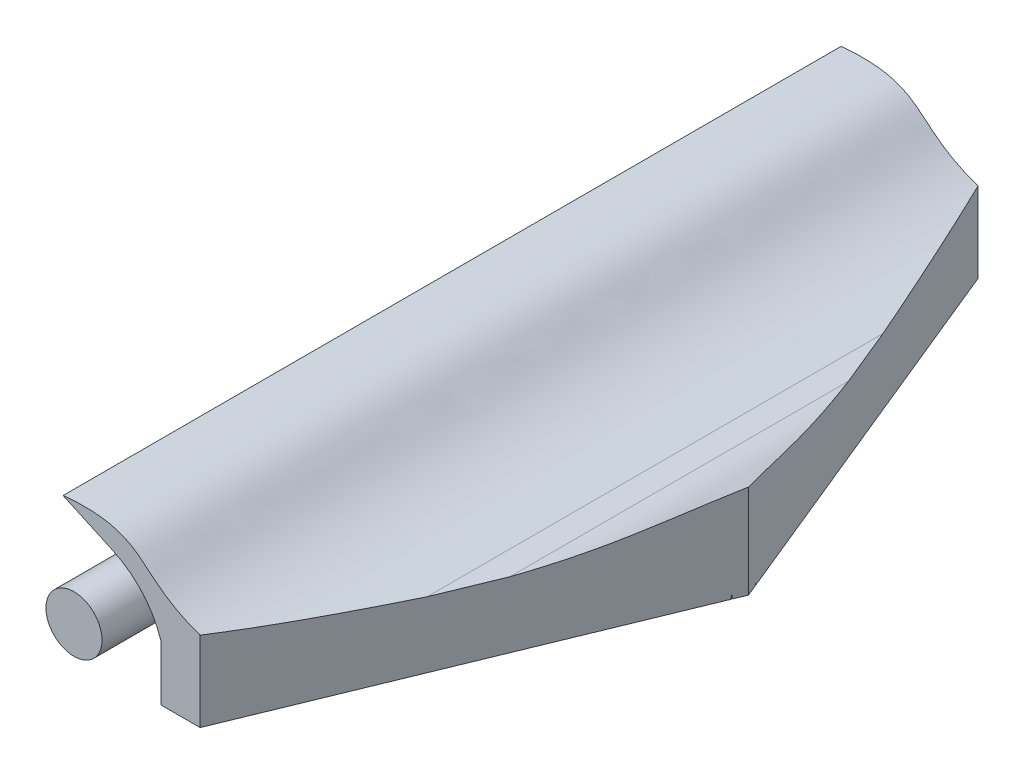
ISO-10303-21;
HEADER;
FILE_DESCRIPTION(('STEP AP214'),'2;1');
FILE_NAME('part.step','',(''),(''),'','','');
FILE_SCHEMA(('AUTOMOTIVE_DESIGN { 1 0 10303 214 1 1 1 1 }'));
ENDSEC;
DATA;
#1=APPLICATION_CONTEXT('core data for automotive mechanical design processes');
#2=APPLICATION_PROTOCOL_DEFINITION('international standard','automotive_design',2000,#1);
#3=PRODUCT_CONTEXT('',#1,'mechanical');
#4=PRODUCT('Part','Part','',(#3));
#5=PRODUCT_RELATED_PRODUCT_CATEGORY('part','',(#4));
#6=PRODUCT_DEFINITION_FORMATION('','',#4);
#7=PRODUCT_DEFINITION_CONTEXT('part definition',#1,'design');
#8=PRODUCT_DEFINITION('design','',#6,#7);
#9=PRODUCT_DEFINITION_SHAPE('','',#8);
#10=(LENGTH_UNIT() NAMED_UNIT(*) SI_UNIT(.MILLI.,.METRE.));
#11=(NAMED_UNIT(*) PLANE_ANGLE_UNIT() SI_UNIT($,.RADIAN.));
#12=(NAMED_UNIT(*) SI_UNIT($,.STERADIAN.) SOLID_ANGLE_UNIT());
#13=UNCERTAINTY_MEASURE_WITH_UNIT(LENGTH_MEASURE(1.E-05),#10,'distance_accuracy_value','');
#14=(GEOMETRIC_REPRESENTATION_CONTEXT(3) GLOBAL_UNCERTAINTY_ASSIGNED_CONTEXT((#13)) GLOBAL_UNIT_ASSIGNED_CONTEXT((#10,
#11,#12)) REPRESENTATION_CONTEXT('',''));
#15=CARTESIAN_POINT('',(0.,0.,0.));
#16=DIRECTION('',(0.,0.,1.));
#17=DIRECTION('',(1.,0.,0.));
#18=AXIS2_PLACEMENT_3D('',#15,#16,#17);
#19=CARTESIAN_POINT('',(21.6753952331775,-1.77266019011113,55.49));
#20=DIRECTION('',(0.,0.,-1.));
#21=DIRECTION('',(-1.,0.,0.));
#22=AXIS2_PLACEMENT_3D('',#19,#20,#21);
#23=CYLINDRICAL_SURFACE('',#22,1.75);
#24=CARTESIAN_POINT('',(21.6753952331775,-1.77266019011113,31.166761834755));
#25=DIRECTION('',(0.92525930002259,0.,-0.379335244502415));
#26=DIRECTION('',(-0.379335244502415,0.,-0.92525930002259));
#27=AXIS2_PLACEMENT_3D('',#24,#25,#26);
#28=ELLIPSE('',#27,4.61333352321514,1.75);
#29=CARTESIAN_POINT('',(19.9285760203476,-1.66719627358837,26.9059905366672));
#30=VERTEX_POINT('',#29);
#31=CARTESIAN_POINT('',(19.9402247485162,-2.,26.9344036467793));
#32=VERTEX_POINT('',#31);
#33=EDGE_CURVE('E179',#30,#32,#28,.F.);
#34=ORIENTED_EDGE('',*,*,#33,.T.);
#35=DIRECTION('',(0.,0.,-1.));
#36=VECTOR('',#35,1.);
#37=CARTESIAN_POINT('',(19.9402247485162,-2.,55.49));
#38=LINE('',#37,#36);
#39=CARTESIAN_POINT('',(19.9402247485162,-2.,28.5555963532207));
#40=VERTEX_POINT('',#39);
#41=EDGE_CURVE('E168',#32,#40,#38,.F.);
#42=ORIENTED_EDGE('',*,*,#41,.T.);
#43=CARTESIAN_POINT('',(21.6753952331775,-1.77266019011113,24.323238165245));
#44=DIRECTION('',(-0.92525930002259,0.,-0.379335244502416));
#45=DIRECTION('',(0.379335244502416,0.,-0.92525930002259));
#46=AXIS2_PLACEMENT_3D('',#43,#44,#45);
#47=ELLIPSE('',#46,4.61333352321513,1.75);
#48=CARTESIAN_POINT('',(19.9285760203476,-1.66719627358837,28.5840094633328));
#49=VERTEX_POINT('',#48);
#50=EDGE_CURVE('E177',#49,#40,#47,.F.);
#51=ORIENTED_EDGE('',*,*,#50,.F.);
#52=DIRECTION('',(0.,0.,-1.));
#53=VECTOR('',#52,1.);
#54=CARTESIAN_POINT('',(19.9285760203476,-1.66719627358837,55.49));
#55=LINE('',#54,#53);
#56=EDGE_CURVE('E305',#49,#30,#55,.T.);
#57=ORIENTED_EDGE('',*,*,#56,.T.);
#58=EDGE_LOOP('',(#34,#42,#51,#57));
#59=FACE_BOUND('',#58,.T.);
#60=ADVANCED_FACE('F43',(#59),#23,.T.);
#61=CARTESIAN_POINT('',(7.61739130704758,10.,-3.12295698498672));
#62=DIRECTION('',(0.92525930002259,0.,-0.379335244502415));
#63=DIRECTION('',(-0.379335244502415,0.,-0.92525930002259));
#64=AXIS2_PLACEMENT_3D('',#61,#62,#63);
#65=PLANE('',#64);
#66=DIRECTION('',(0.,-1.,0.));
#67=VECTOR('',#66,1.);
#68=CARTESIAN_POINT('',(20.2725507957489,10.,27.745));
#69=LINE('',#68,#67);
#70=CARTESIAN_POINT('',(20.2725507957489,4.67911544791502,27.745));
#71=VERTEX_POINT('',#70);
#72=CARTESIAN_POINT('',(20.2725507957489,-2.,27.745));
#73=VERTEX_POINT('',#72);
#74=EDGE_CURVE('E608',#71,#73,#69,.T.);
#75=ORIENTED_EDGE('',*,*,#74,.T.);
#76=DIRECTION('',(0.379335244502415,0.,0.92525930002259));
#77=VECTOR('',#76,1.);
#78=CARTESIAN_POINT('',(16.4791983507247,-2.,18.4924069997741));
#79=LINE('',#78,#77);
#80=EDGE_CURVE('E62',#32,#73,#79,.T.);
#81=ORIENTED_EDGE('',*,*,#80,.F.);
#82=ORIENTED_EDGE('',*,*,#33,.F.);
#83=DIRECTION('',(0.0596243597949732,0.987569783832803,0.145433344799156));
#84=VECTOR('',#83,1.);
#85=CARTESIAN_POINT('',(20.2037610543757,2.89074657902551,27.5772108243985));
#86=LINE('',#85,#84);
#87=CARTESIAN_POINT('',(19.9084830512739,-2.,26.8569805731324));
#88=VERTEX_POINT('',#87);
#89=EDGE_CURVE('E600',#88,#30,#86,.T.);
#90=ORIENTED_EDGE('',*,*,#89,.F.);
#91=DIRECTION('',(-0.379335244502415,0.,-0.92525930002259));
#92=VECTOR('',#91,1.);
#93=CARTESIAN_POINT('',(25.1279562662495,-2.,39.5881101039773));
#94=LINE('',#93,#92);
#95=CARTESIAN_POINT('',(8.89773255997154,-2.,0.));
#96=VERTEX_POINT('',#95);
#97=EDGE_CURVE('E593',#88,#96,#94,.T.);
#98=ORIENTED_EDGE('',*,*,#97,.T.);
#99=DIRECTION('',(0.,-1.,0.));
#100=VECTOR('',#99,1.);
#101=CARTESIAN_POINT('',(8.89773255997154,10.,0.));
#102=LINE('',#101,#100);
#103=CARTESIAN_POINT('',(8.89773255997154,3.71152769426705,0.));
#104=VERTEX_POINT('',#103);
#105=EDGE_CURVE('E181',#104,#96,#102,.T.);
#106=ORIENTED_EDGE('',*,*,#105,.F.);
#107=CARTESIAN_POINT('',(8.89773256020127,3.71152769426705,7.04898028266554E-11));
#108=CARTESIAN_POINT('',(9.05407822295495,3.6572797498824,0.381352064495441));
#109=CARTESIAN_POINT('',(9.21057016520124,3.60604397801412,0.763060927801186));
#110=CARTESIAN_POINT('',(9.523734200367,3.50888937245856,1.52691807053927));
#111=CARTESIAN_POINT('',(9.68040620695662,3.46296860982706,1.90906613939935));
#112=CARTESIAN_POINT('',(9.99390001735064,3.37570704249431,2.67372765651594));
#113=CARTESIAN_POINT('',(10.1507217842295,3.3343653086633,3.05624101470518));
#114=CARTESIAN_POINT('',(10.4644943694529,3.25569416000564,3.82158250822616));
#115=CARTESIAN_POINT('',(10.6214451739467,3.21836435996396,4.20441060977398));
#116=CARTESIAN_POINT('',(10.9354575285465,3.14723950538034,4.97033693912361));
#117=CARTESIAN_POINT('',(11.0925190757886,3.113444362584,5.35343515994046));
#118=CARTESIAN_POINT('',(11.4067159371557,3.04899847280158,6.11981153079238));
#119=CARTESIAN_POINT('',(11.5638512403528,3.01834735421682,6.50308965417267));
#120=CARTESIAN_POINT('',(11.8782119422224,2.95985055526556,7.26986565820032));
#121=CARTESIAN_POINT('',(12.0354373481268,2.93200514595534,7.65336355648745));
#122=CARTESIAN_POINT('',(12.3499718067072,2.878838670191,8.42056338090885));
#123=CARTESIAN_POINT('',(12.507280868094,2.85351796297069,8.80426532829032));
#124=CARTESIAN_POINT('',(12.8219769989744,2.80515913754457,9.5718594972955));
#125=CARTESIAN_POINT('',(12.979364077318,2.7821214211949,9.95575174050591));
#126=CARTESIAN_POINT('',(13.294211817106,2.73812795287087,10.7237157078723));
#127=CARTESIAN_POINT('',(13.4516724869775,2.71717261937415,11.107787452583));
#128=CARTESIAN_POINT('',(13.6091499864008,2.69716019884859,11.4919002472612));
#129=B_SPLINE_CURVE_WITH_KNOTS('',3,(#107,#108,#109,#110,#111,#112,#113,#114,#115,#116,#117,
#118,#119,#120,#121,#122,#123,#124,#125,#126,#127,#128),.UNSPECIFIED.,.F.,.F.,(4,2,2,2,2,2,2,2,
2,2,4),(0.,1.24710836203711,2.49376268988389,3.74016359415216,4.98644471525424,6.23269471139653,
7.47879724055755,8.72502003902671,9.97141990725707,11.2180387807805,12.4649076715347),.UNSPECIFIED.);
#130=CARTESIAN_POINT('',(13.6091499864008,2.69716019884859,11.4919002472612));
#131=VERTEX_POINT('',#130);
#132=EDGE_CURVE('E12',#104,#131,#129,.T.);
#133=ORIENTED_EDGE('',*,*,#132,.T.);
#134=DIRECTION('',(0.379335244502415,0.,0.92525930002259));
#135=VECTOR('',#134,1.);
#136=CARTESIAN_POINT('',(-1.79344106666902,2.69716019884859,-26.0774815142241));
#137=LINE('',#136,#135);
#138=CARTESIAN_POINT('',(15.3226767719573,2.69716019884859,15.6714659932641));
#139=VERTEX_POINT('',#138);
#140=EDGE_CURVE('E216',#131,#139,#137,.T.);
#141=ORIENTED_EDGE('',*,*,#140,.T.);
#142=CARTESIAN_POINT('',(15.3226767719573,2.69716019884859,15.6714659932641));
#143=CARTESIAN_POINT('',(15.4266575512944,2.71039382821165,15.9250917359274));
#144=CARTESIAN_POINT('',(15.5306059619518,2.72547184417969,16.1786385262064));
#145=CARTESIAN_POINT('',(15.7384162692592,2.75954935490961,16.6855210852709));
#146=CARTESIAN_POINT('',(15.8422781603684,2.77854908394899,16.9388568405413));
#147=CARTESIAN_POINT('',(16.0498821708658,2.82070139363354,17.4452362087086));
#148=CARTESIAN_POINT('',(16.1536242891461,2.84385401238622,17.6982798189032));
#149=CARTESIAN_POINT('',(16.3609554334376,2.89450460709154,18.203993622775));
#150=CARTESIAN_POINT('',(16.4645444603902,2.92200255620644,18.4566638187489));
#151=CARTESIAN_POINT('',(16.6713688460444,2.98142873308947,18.9611415572966));
#152=CARTESIAN_POINT('',(16.7746045060016,3.01334966587837,19.212949834681));
#153=CARTESIAN_POINT('',(16.9808574049633,3.08169399857571,19.7160336258307));
#154=CARTESIAN_POINT('',(17.0838746515818,3.11811723881772,19.9673091581676));
#155=CARTESIAN_POINT('',(17.2896660117709,3.19537459756364,20.4692671824712));
#156=CARTESIAN_POINT('',(17.3924401356223,3.23620852601908,20.7199496995146));
#157=CARTESIAN_POINT('',(17.5977295694949,3.32202549137947,21.2206834452975));
#158=CARTESIAN_POINT('',(17.7002448998479,3.36700819121534,21.4707347236295));
#159=CARTESIAN_POINT('',(17.9058407930843,3.46103693349516,21.9722159727892));
#160=CARTESIAN_POINT('',(18.0089194196234,3.51011228073266,22.2236412205639));
#161=CARTESIAN_POINT('',(18.2148616928643,3.61132844946318,22.725967345925));
#162=CARTESIAN_POINT('',(18.3177253334437,3.66346935705868,22.9768682085779));
#163=CARTESIAN_POINT('',(18.5232989519508,3.76992925504931,23.4782951261125));
#164=CARTESIAN_POINT('',(18.6260089151081,3.82424844240502,23.7288211449667));
#165=CARTESIAN_POINT('',(18.8313484925791,3.93402139677703,24.2296771990011));
#166=CARTESIAN_POINT('',(18.9339781007132,3.98947524356362,24.4800072191086));
#167=CARTESIAN_POINT('',(19.1394126971326,4.10049327261835,24.9810950395476));
#168=CARTESIAN_POINT('',(19.2422176834462,4.15605748060615,25.2318528350701));
#169=CARTESIAN_POINT('',(19.447904102363,4.26610241274871,25.7335548908354));
#170=CARTESIAN_POINT('',(19.5507855291638,4.32058321184996,25.9844991369255));
#171=CARTESIAN_POINT('',(19.7566951629929,4.42746268643741,26.4867456495438));
#172=CARTESIAN_POINT('',(19.8597233553807,4.47986155633774,26.7380478803619));
#173=CARTESIAN_POINT('',(20.0659767980235,4.58181362178772,27.2411329976365));
#174=CARTESIAN_POINT('',(20.1692020391559,4.6313669459225,27.4929158618419));
#175=CARTESIAN_POINT('',(20.2725507957489,4.67911544791499,27.745));
#176=B_SPLINE_CURVE_WITH_KNOTS('',3,(#142,#143,#144,#145,#146,#147,#148,#149,#150,#151,#152,
#153,#154,#155,#156,#157,#158,#159,#160,#161,#162,#163,#164,#165,#166,#167,#168,#169,#170,#171,
#172,#173,#174,#175),.UNSPECIFIED.,.F.,.F.,(4,2,2,2,2,2,2,2,2,2,2,2,2,2,2,2,4),(0.,
0.823296536728848,1.64664227025425,2.46999555930528,3.29334376333992,4.11534980674984,
4.93732670751606,5.75926820492103,6.58114298198758,7.40951345214785,8.23790719989442,
9.06637602084461,9.89490328736118,10.7248556486235,11.5547503954963,12.3845674623551,
13.2143470017063),.UNSPECIFIED.);
#177=EDGE_CURVE('E219',#139,#71,#176,.T.);
#178=ORIENTED_EDGE('',*,*,#177,.T.);
#179=EDGE_LOOP('',(#75,#81,#82,#90,#98,#106,#133,#141,#178));
#180=FACE_BOUND('',#179,.T.);
#181=ADVANCED_FACE('F232',(#180),#65,.T.);
#182=CARTESIAN_POINT('',(27.0934636579418,10.,11.1077031712643));
#183=DIRECTION('',(-0.92525930002259,0.,-0.379335244502416));
#184=DIRECTION('',(-0.379335244502416,0.,0.92525930002259));
#185=AXIS2_PLACEMENT_3D('',#182,#183,#184);
#186=PLANE('',#185);
#187=DIRECTION('',(0.379335244502416,0.,-0.92525930002259));
#188=VECTOR('',#187,1.);
#189=CARTESIAN_POINT('',(27.0934636579418,-2.,11.1077031712643));
#190=LINE('',#189,#188);
#191=EDGE_CURVE('E165',#40,#73,#190,.T.);
#192=ORIENTED_EDGE('',*,*,#191,.T.);
#193=ORIENTED_EDGE('',*,*,#74,.F.);
#194=CARTESIAN_POINT('',(15.3226767719573,2.69716019884859,39.8185340067359));
#195=CARTESIAN_POINT('',(15.4266575512944,2.71039382821165,39.5649082640726));
#196=CARTESIAN_POINT('',(15.5306059619518,2.72547184417969,39.3113614737936));
#197=CARTESIAN_POINT('',(15.7384162692592,2.75954935490961,38.8044789147291));
#198=CARTESIAN_POINT('',(15.8422781603684,2.77854908394899,38.5511431594587));
#199=CARTESIAN_POINT('',(16.0498821708658,2.82070139363354,38.0447637912914));
#200=CARTESIAN_POINT('',(16.1536242891462,2.84385401238622,37.7917201810968));
#201=CARTESIAN_POINT('',(16.3609554334376,2.89450460709154,37.286006377225));
#202=CARTESIAN_POINT('',(16.4645444603902,2.92200255620644,37.0333361812511));
#203=CARTESIAN_POINT('',(16.6713688460444,2.98142873308947,36.5288584427034));
#204=CARTESIAN_POINT('',(16.7746045060016,3.01334966587837,36.277050165319));
#205=CARTESIAN_POINT('',(16.9808574049633,3.08169399857571,35.7739663741693));
#206=CARTESIAN_POINT('',(17.0838746515818,3.11811723881772,35.5226908418324));
#207=CARTESIAN_POINT('',(17.2896660117709,3.19537459756364,35.0207328175288));
#208=CARTESIAN_POINT('',(17.3924401356223,3.23620852601907,34.7700503004854));
#209=CARTESIAN_POINT('',(17.5977295694949,3.32202549137947,34.2693165547025));
#210=CARTESIAN_POINT('',(17.7002448998479,3.36700819121534,34.0192652763705));
#211=CARTESIAN_POINT('',(17.9058407930843,3.46103693349516,33.5177840272108));
#212=CARTESIAN_POINT('',(18.0089194196234,3.51011228073266,33.2663587794361));
#213=CARTESIAN_POINT('',(18.2148616928643,3.61132844946318,32.764032654075));
#214=CARTESIAN_POINT('',(18.3177253334437,3.66346935705868,32.5131317914221));
#215=CARTESIAN_POINT('',(18.5232989519508,3.76992925504931,32.0117048738875));
#216=CARTESIAN_POINT('',(18.6260089151081,3.82424844240502,31.7611788550333));
#217=CARTESIAN_POINT('',(18.8313484925791,3.93402139677704,31.2603228009989));
#218=CARTESIAN_POINT('',(18.9339781007132,3.98947524356362,31.0099927808913));
#219=CARTESIAN_POINT('',(19.1394126971326,4.10049327261835,30.5089049604524));
#220=CARTESIAN_POINT('',(19.2422176834462,4.15605748060616,30.2581471649299));
#221=CARTESIAN_POINT('',(19.447904102363,4.26610241274871,29.7564451091646));
#222=CARTESIAN_POINT('',(19.5507855291638,4.32058321184996,29.5055008630745));
#223=CARTESIAN_POINT('',(19.7566951629929,4.42746268643741,29.0032543504562));
#224=CARTESIAN_POINT('',(19.8597233553807,4.47986155633774,28.7519521196381));
#225=CARTESIAN_POINT('',(20.0659767980235,4.58181362178772,28.2488670023635));
#226=CARTESIAN_POINT('',(20.1692020391559,4.6313669459225,27.9970841381581));
#227=CARTESIAN_POINT('',(20.2725507957489,4.67911544791499,27.745));
#228=B_SPLINE_CURVE_WITH_KNOTS('',3,(#194,#195,#196,#197,#198,#199,#200,#201,#202,#203,#204,
#205,#206,#207,#208,#209,#210,#211,#212,#213,#214,#215,#216,#217,#218,#219,#220,#221,#222,#223,
#224,#225,#226,#227),.UNSPECIFIED.,.F.,.F.,(4,2,2,2,2,2,2,2,2,2,2,2,2,2,2,2,4),(0.,
0.823296536728846,1.64664227025426,2.46999555930529,3.29334376333993,4.11534980674984,
4.93732670751607,5.75926820492103,6.58114298198758,7.40951345214786,8.23790719989442,
9.06637602084461,9.89490328736118,10.7248556486235,11.5547503954963,12.384567462355,
13.2143470017063),.UNSPECIFIED.);
#229=CARTESIAN_POINT('',(15.3226767719573,2.69716019884859,39.8185340067359));
#230=VERTEX_POINT('',#229);
#231=EDGE_CURVE('E187',#230,#71,#228,.T.);
#232=ORIENTED_EDGE('',*,*,#231,.F.);
#233=DIRECTION('',(0.379335244502416,0.,-0.92525930002259));
#234=VECTOR('',#233,1.);
#235=CARTESIAN_POINT('',(36.5042960316584,2.69716019884859,-11.8468213579731));
#236=LINE('',#235,#234);
#237=CARTESIAN_POINT('',(13.6091499864008,2.69716019884859,43.9980997527388));
#238=VERTEX_POINT('',#237);
#239=EDGE_CURVE('E70',#238,#230,#236,.T.);
#240=ORIENTED_EDGE('',*,*,#239,.F.);
#241=CARTESIAN_POINT('',(8.89773256020125,3.71152769426706,55.4899999999295));
#242=CARTESIAN_POINT('',(9.05407822295493,3.65727974988241,55.1086479355046));
#243=CARTESIAN_POINT('',(9.21057016520122,3.60604397801413,54.7269390721988));
#244=CARTESIAN_POINT('',(9.52373420036699,3.50888937245856,53.9630819294607));
#245=CARTESIAN_POINT('',(9.6804062069566,3.46296860982706,53.5809338606007));
#246=CARTESIAN_POINT('',(9.99390001735062,3.37570704249431,52.8162723434841));
#247=CARTESIAN_POINT('',(10.1507217842295,3.3343653086633,52.4337589852948));
#248=CARTESIAN_POINT('',(10.4644943694529,3.25569416000565,51.6684174917738));
#249=CARTESIAN_POINT('',(10.6214451739467,3.21836435996397,51.285589390226));
#250=CARTESIAN_POINT('',(10.9354575285464,3.14723950538034,50.5196630608764));
#251=CARTESIAN_POINT('',(11.0925190757886,3.113444362584,50.1365648400595));
#252=CARTESIAN_POINT('',(11.4067159371557,3.04899847280158,49.3701884692076));
#253=CARTESIAN_POINT('',(11.5638512403528,3.01834735421682,48.9869103458273));
#254=CARTESIAN_POINT('',(11.8782119422223,2.95985055526556,48.2201343417997));
#255=CARTESIAN_POINT('',(12.0354373481268,2.93200514595534,47.8366364435125));
#256=CARTESIAN_POINT('',(12.3499718067072,2.878838670191,47.0694366190911));
#257=CARTESIAN_POINT('',(12.507280868094,2.85351796297069,46.6857346717097));
#258=CARTESIAN_POINT('',(12.8219769989744,2.80515913754457,45.9181405027045));
#259=CARTESIAN_POINT('',(12.979364077318,2.7821214211949,45.5342482594941));
#260=CARTESIAN_POINT('',(13.294211817106,2.73812795287087,44.7662842921277));
#261=CARTESIAN_POINT('',(13.4516724869775,2.71717261937415,44.382212547417));
#262=CARTESIAN_POINT('',(13.6091499864008,2.69716019884859,43.9980997527388));
#263=B_SPLINE_CURVE_WITH_KNOTS('',3,(#241,#242,#243,#244,#245,#246,#247,#248,#249,#250,#251,
#252,#253,#254,#255,#256,#257,#258,#259,#260,#261,#262),.UNSPECIFIED.,.F.,.F.,(4,2,2,2,2,2,2,2,
2,2,4),(0.,1.24710836203711,2.4937626898839,3.74016359415217,4.98644471525426,6.23269471139655,
7.47879724055757,8.72502003902673,9.9714199072571,11.2180387807805,12.4649076715348),.UNSPECIFIED.);
#264=CARTESIAN_POINT('',(8.89773255997152,3.7115276944065,55.49));
#265=VERTEX_POINT('',#264);
#266=EDGE_CURVE('E54',#265,#238,#263,.T.);
#267=ORIENTED_EDGE('',*,*,#266,.F.);
#268=DIRECTION('',(0.,-1.,0.));
#269=VECTOR('',#268,1.);
#270=CARTESIAN_POINT('',(8.89773255997152,10.,55.49));
#271=LINE('',#270,#269);
#272=CARTESIAN_POINT('',(8.89773255997152,-2.,55.49));
#273=VERTEX_POINT('',#272);
#274=EDGE_CURVE('E606',#265,#273,#271,.T.);
#275=ORIENTED_EDGE('',*,*,#274,.T.);
#276=DIRECTION('',(-0.379335244502416,0.,0.92525930002259));
#277=VECTOR('',#276,1.);
#278=CARTESIAN_POINT('',(9.58289869873991,-2.,53.8187702602283));
#279=LINE('',#278,#277);
#280=CARTESIAN_POINT('',(19.9084830512739,-2.,28.6330194268676));
#281=VERTEX_POINT('',#280);
#282=EDGE_CURVE('E191',#281,#273,#279,.T.);
#283=ORIENTED_EDGE('',*,*,#282,.F.);
#284=DIRECTION('',(0.0596243597949732,0.987569783832803,-0.145433344799156));
#285=VECTOR('',#284,1.);
#286=CARTESIAN_POINT('',(19.7225867288312,-5.07903668234446,29.0864502737843));
#287=LINE('',#286,#285);
#288=EDGE_CURVE('E185',#281,#49,#287,.T.);
#289=ORIENTED_EDGE('',*,*,#288,.T.);
#290=ORIENTED_EDGE('',*,*,#50,.T.);
#291=EDGE_LOOP('',(#192,#193,#232,#240,#267,#275,#283,#289,#290));
#292=FACE_BOUND('',#291,.T.);
#293=ADVANCED_FACE('F183',(#292),#186,.F.);
#294=CARTESIAN_POINT('',(0.,0.,0.));
#295=DIRECTION('',(0.,0.,1.));
#296=DIRECTION('',(1.,0.,0.));
#297=AXIS2_PLACEMENT_3D('',#294,#295,#296);
#298=PLANE('',#297);
#299=ORIENTED_EDGE('',*,*,#105,.T.);
#300=DIRECTION('',(-1.,0.,0.));
#301=VECTOR('',#300,1.);
#302=CARTESIAN_POINT('',(0.,-2.,0.));
#303=LINE('',#302,#301);
#304=CARTESIAN_POINT('',(6.09130206674588,-2.,0.));
#305=VERTEX_POINT('',#304);
#306=EDGE_CURVE('E272',#96,#305,#303,.T.);
#307=ORIENTED_EDGE('',*,*,#306,.T.);
#308=DIRECTION('',(0.,-1.,0.));
#309=VECTOR('',#308,1.);
#310=CARTESIAN_POINT('',(6.09130206674588,0.,0.));
#311=LINE('',#310,#309);
#312=CARTESIAN_POINT('',(6.09130206674588,2.,0.));
#313=VERTEX_POINT('',#312);
#314=EDGE_CURVE('E500',#313,#305,#311,.T.);
#315=ORIENTED_EDGE('',*,*,#314,.F.);
#316=CARTESIAN_POINT('',(0.000126124464839075,-0.000288294002662691,0.));
#317=DIRECTION('',(0.,0.,1.));
#318=DIRECTION('',(1.,0.,0.));
#319=AXIS2_PLACEMENT_3D('',#316,#317,#318);
#320=CIRCLE('',#319,6.41120718889566);
#321=CARTESIAN_POINT('',(2.66521443689794,5.83073922315757,0.));
#322=VERTEX_POINT('',#321);
#323=EDGE_CURVE('E421',#322,#313,#320,.F.);
#324=ORIENTED_EDGE('',*,*,#323,.F.);
#325=DIRECTION('',(0.909490184402583,-0.4157253955141,0.));
#326=VECTOR('',#325,1.);
#327=CARTESIAN_POINT('',(2.66521443689794,5.83073922315757,0.));
#328=LINE('',#327,#326);
#329=CARTESIAN_POINT('',(-0.877126137495203,7.44993309857313,0.));
#330=VERTEX_POINT('',#329);
#331=EDGE_CURVE('E417',#330,#322,#328,.T.);
#332=ORIENTED_EDGE('',*,*,#331,.F.);
#333=CARTESIAN_POINT('',(13.6091499864008,2.69716019884859,0.));
#334=CARTESIAN_POINT('',(3.00893748679324,4.04391262787319,0.));
#335=CARTESIAN_POINT('',(6.6435499353925,7.42707390078312,0.));
#336=CARTESIAN_POINT('',(2.23172476193558,7.79282106542209,0.));
#337=CARTESIAN_POINT('',(-0.877126137495203,7.44993309857313,0.));
#338=B_SPLINE_CURVE_WITH_KNOTS('',4,(#333,#334,#335,#336,#337),.UNSPECIFIED.,.F.,.F.,(5,5),(0.,
1.),.UNSPECIFIED.);
#339=EDGE_CURVE('E422',#104,#330,#338,.T.);
#340=ORIENTED_EDGE('',*,*,#339,.F.);
#341=EDGE_LOOP('',(#299,#307,#315,#324,#332,#340));
#342=FACE_BOUND('',#341,.T.);
#343=ADVANCED_FACE('F497',(#342),#298,.F.);
#344=CARTESIAN_POINT('',(0.,0.,55.49));
#345=DIRECTION('',(0.,0.,1.));
#346=DIRECTION('',(1.,0.,0.));
#347=AXIS2_PLACEMENT_3D('',#344,#345,#346);
#348=PLANE('',#347);
#349=DIRECTION('',(1.,0.,0.));
#350=VECTOR('',#349,1.);
#351=CARTESIAN_POINT('',(0.,-2.,55.49));
#352=LINE('',#351,#350);
#353=CARTESIAN_POINT('',(6.09130206674588,-2.,55.49));
#354=VERTEX_POINT('',#353);
#355=EDGE_CURVE('E287',#354,#273,#352,.T.);
#356=ORIENTED_EDGE('',*,*,#355,.T.);
#357=ORIENTED_EDGE('',*,*,#274,.F.);
#358=CARTESIAN_POINT('',(13.6091499864008,2.69716019884859,55.49));
#359=CARTESIAN_POINT('',(3.00893748679324,4.04391262787319,55.49));
#360=CARTESIAN_POINT('',(6.6435499353925,7.42707390078312,55.49));
#361=CARTESIAN_POINT('',(2.23172476193558,7.79282106542209,55.49));
#362=CARTESIAN_POINT('',(-0.877126137495203,7.44993309857313,55.49));
#363=B_SPLINE_CURVE_WITH_KNOTS('',4,(#358,#359,#360,#361,#362),.UNSPECIFIED.,.F.,.F.,(5,5),(0.,
1.),.UNSPECIFIED.);
#364=CARTESIAN_POINT('',(-0.877126137495203,7.44993309857313,55.49));
#365=VERTEX_POINT('',#364);
#366=EDGE_CURVE('E336',#265,#365,#363,.T.);
#367=ORIENTED_EDGE('',*,*,#366,.T.);
#368=DIRECTION('',(0.909490184402584,-0.415725395514098,0.));
#369=VECTOR('',#368,1.);
#370=CARTESIAN_POINT('',(2.66521443689795,5.83073922315758,55.49));
#371=LINE('',#370,#369);
#372=CARTESIAN_POINT('',(2.66521443689795,5.83073922315758,55.49));
#373=VERTEX_POINT('',#372);
#374=EDGE_CURVE('E461',#365,#373,#371,.T.);
#375=ORIENTED_EDGE('',*,*,#374,.T.);
#376=CARTESIAN_POINT('',(0.,0.,55.49));
#377=DIRECTION('',(0.,0.,1.));
#378=DIRECTION('',(1.,0.,0.));
#379=AXIS2_PLACEMENT_3D('',#376,#377,#378);
#380=CIRCLE('',#379,6.41099741718225);
#381=CARTESIAN_POINT('',(6.09113930397736,1.99983901627577,55.49));
#382=VERTEX_POINT('',#381);
#383=EDGE_CURVE('E457',#382,#373,#380,.T.);
#384=ORIENTED_EDGE('',*,*,#383,.F.);
#385=DIRECTION('',(0.,1.,0.));
#386=VECTOR('',#385,1.);
#387=CARTESIAN_POINT('',(6.09130206674588,0.,55.49));
#388=LINE('',#387,#386);
#389=EDGE_CURVE('E588',#354,#382,#388,.T.);
#390=ORIENTED_EDGE('',*,*,#389,.F.);
#391=EDGE_LOOP('',(#356,#357,#367,#375,#384,#390));
#392=FACE_BOUND('',#391,.T.);
#393=ADVANCED_FACE('F512',(#392),#348,.T.);
#394=CARTESIAN_POINT('',(0.,-2.,49.89));
#395=DIRECTION('',(0.,1.,0.));
#396=DIRECTION('',(0.,0.,1.));
#397=AXIS2_PLACEMENT_3D('',#394,#395,#396);
#398=PLANE('',#397);
#399=ORIENTED_EDGE('',*,*,#97,.F.);
#400=DIRECTION('',(0.,0.,-1.));
#401=VECTOR('',#400,1.);
#402=CARTESIAN_POINT('',(19.9084830512739,-2.,49.89));
#403=LINE('',#402,#401);
#404=EDGE_CURVE('E288',#281,#88,#403,.T.);
#405=ORIENTED_EDGE('',*,*,#404,.F.);
#406=ORIENTED_EDGE('',*,*,#282,.T.);
#407=ORIENTED_EDGE('',*,*,#355,.F.);
#408=DIRECTION('',(0.,0.,1.));
#409=VECTOR('',#408,1.);
#410=CARTESIAN_POINT('',(6.09130206674588,-2.,49.99));
#411=LINE('',#410,#409);
#412=CARTESIAN_POINT('',(6.09130206674588,-2.,49.99));
#413=VERTEX_POINT('',#412);
#414=EDGE_CURVE('E574',#413,#354,#411,.T.);
#415=ORIENTED_EDGE('',*,*,#414,.F.);
#416=DIRECTION('',(-1.,0.,0.));
#417=VECTOR('',#416,1.);
#418=CARTESIAN_POINT('',(0.,-2.,49.99));
#419=LINE('',#418,#417);
#420=CARTESIAN_POINT('',(0.,-2.,49.99));
#421=VERTEX_POINT('',#420);
#422=EDGE_CURVE('E413',#413,#421,#419,.T.);
#423=ORIENTED_EDGE('',*,*,#422,.T.);
#424=DIRECTION('',(0.,0.,-1.));
#425=VECTOR('',#424,1.);
#426=CARTESIAN_POINT('',(0.,-2.,49.89));
#427=LINE('',#426,#425);
#428=CARTESIAN_POINT('',(0.,-2.,5.5));
#429=VERTEX_POINT('',#428);
#430=EDGE_CURVE('E296',#421,#429,#427,.T.);
#431=ORIENTED_EDGE('',*,*,#430,.T.);
#432=DIRECTION('',(1.,0.,0.));
#433=VECTOR('',#432,1.);
#434=CARTESIAN_POINT('',(0.,-2.,5.5));
#435=LINE('',#434,#433);
#436=CARTESIAN_POINT('',(6.09130206674588,-2.,5.5));
#437=VERTEX_POINT('',#436);
#438=EDGE_CURVE('E398',#429,#437,#435,.T.);
#439=ORIENTED_EDGE('',*,*,#438,.T.);
#440=DIRECTION('',(0.,0.,-1.));
#441=VECTOR('',#440,1.);
#442=CARTESIAN_POINT('',(6.09130206674588,-2.,5.5));
#443=LINE('',#442,#441);
#444=EDGE_CURVE('E265',#437,#305,#443,.T.);
#445=ORIENTED_EDGE('',*,*,#444,.T.);
#446=ORIENTED_EDGE('',*,*,#306,.F.);
#447=EDGE_LOOP('',(#399,#405,#406,#407,#415,#423,#431,#439,#445,#446));
#448=FACE_BOUND('',#447,.T.);
#449=ADVANCED_FACE('F517',(#448),#398,.F.);
#450=CARTESIAN_POINT('',(19.9564889116432,-1.20486966550777,55.49));
#451=DIRECTION('',(0.998182407331373,-0.0602650951558623,0.));
#452=DIRECTION('',(0.0602650951558623,0.998182407331373,0.));
#453=AXIS2_PLACEMENT_3D('',#450,#451,#452);
#454=PLANE('',#453);
#455=ORIENTED_EDGE('',*,*,#404,.T.);
#456=ORIENTED_EDGE('',*,*,#89,.T.);
#457=ORIENTED_EDGE('',*,*,#56,.F.);
#458=ORIENTED_EDGE('',*,*,#288,.F.);
#459=EDGE_LOOP('',(#455,#456,#457,#458));
#460=FACE_BOUND('',#459,.T.);
#461=ADVANCED_FACE('F513',(#460),#454,.T.);
#462=CARTESIAN_POINT('',(0.,2.69716019884859,-26.8127515142219));
#463=DIRECTION('',(0.,-1.,0.));
#464=DIRECTION('',(0.,0.,-1.));
#465=AXIS2_PLACEMENT_3D('',#462,#463,#464);
#466=PLANE('',#465);
#467=ORIENTED_EDGE('',*,*,#140,.F.);
#468=DIRECTION('',(0.,0.,1.));
#469=VECTOR('',#468,1.);
#470=CARTESIAN_POINT('',(13.6091499864008,2.69716019884859,-26.8127515142219));
#471=LINE('',#470,#469);
#472=EDGE_CURVE('E268',#131,#238,#471,.T.);
#473=ORIENTED_EDGE('',*,*,#472,.T.);
#474=ORIENTED_EDGE('',*,*,#239,.T.);
#475=DIRECTION('',(0.,0.,1.));
#476=VECTOR('',#475,1.);
#477=CARTESIAN_POINT('',(15.3226767719573,2.69716019884859,-26.8127515142219));
#478=LINE('',#477,#476);
#479=EDGE_CURVE('E273',#139,#230,#478,.T.);
#480=ORIENTED_EDGE('',*,*,#479,.F.);
#481=EDGE_LOOP('',(#467,#473,#474,#480));
#482=FACE_BOUND('',#481,.T.);
#483=ADVANCED_FACE('F516',(#482),#466,.F.);
#484=CARTESIAN_POINT('',(15.3226767719573,2.69716019884859,-26.8127515142219));
#485=CARTESIAN_POINT('',(19.2593510513428,3.19828227357009,-26.8127515142219));
#486=CARTESIAN_POINT('',(19.8818146174948,5.92011733240757,-26.8127515142219));
#487=CARTESIAN_POINT('',(25.6726962678702,5.55066934456434,-26.8127515142219));
#488=B_SPLINE_CURVE_WITH_KNOTS('',3,(#484,#485,#486,#487),.UNSPECIFIED.,.F.,.F.,(4,4),(0.,1.),.UNSPECIFIED.);
#489=DIRECTION('',(0.,0.,1.));
#490=VECTOR('',#489,1.);
#491=SURFACE_OF_LINEAR_EXTRUSION('',#488,#490);
#492=ORIENTED_EDGE('',*,*,#177,.F.);
#493=ORIENTED_EDGE('',*,*,#479,.T.);
#494=ORIENTED_EDGE('',*,*,#231,.T.);
#495=EDGE_LOOP('',(#492,#493,#494));
#496=FACE_BOUND('',#495,.T.);
#497=ADVANCED_FACE('F227',(#496),#491,.F.);
#498=CARTESIAN_POINT('',(13.6091499864008,2.69716019884859,78.6138019590983));
#499=CARTESIAN_POINT('',(3.00893748679324,4.04391262787319,78.6138019590983));
#500=CARTESIAN_POINT('',(6.6435499353925,7.42707390078312,78.6138019590983));
#501=CARTESIAN_POINT('',(2.23172476193558,7.79282106542209,78.6138019590983));
#502=CARTESIAN_POINT('',(-0.877126137495203,7.44993309857313,78.6138019590983));
#503=B_SPLINE_CURVE_WITH_KNOTS('',4,(#498,#499,#500,#501,#502),.UNSPECIFIED.,.F.,.F.,(5,5),(0.,
1.),.UNSPECIFIED.);
#504=DIRECTION('',(0.,0.,-1.));
#505=VECTOR('',#504,1.);
#506=SURFACE_OF_LINEAR_EXTRUSION('',#503,#505);
#507=ORIENTED_EDGE('',*,*,#132,.F.);
#508=ORIENTED_EDGE('',*,*,#339,.T.);
#509=DIRECTION('',(0.,0.,-1.));
#510=VECTOR('',#509,1.);
#511=CARTESIAN_POINT('',(-0.877126137495203,7.44993309857313,78.6138019590983));
#512=LINE('',#511,#510);
#513=EDGE_CURVE('E460',#365,#330,#512,.T.);
#514=ORIENTED_EDGE('',*,*,#513,.F.);
#515=ORIENTED_EDGE('',*,*,#366,.F.);
#516=ORIENTED_EDGE('',*,*,#266,.T.);
#517=ORIENTED_EDGE('',*,*,#472,.F.);
#518=EDGE_LOOP('',(#507,#508,#514,#515,#516,#517));
#519=FACE_BOUND('',#518,.T.);
#520=ADVANCED_FACE('F549',(#519),#506,.F.);
#521=CARTESIAN_POINT('',(0.,2.,49.89));
#522=DIRECTION('',(0.,1.,0.));
#523=DIRECTION('',(0.,0.,1.));
#524=AXIS2_PLACEMENT_3D('',#521,#522,#523);
#525=PLANE('',#524);
#526=DIRECTION('',(-1.,0.,0.));
#527=VECTOR('',#526,1.);
#528=CARTESIAN_POINT('',(0.,2.,49.99));
#529=LINE('',#528,#527);
#530=CARTESIAN_POINT('',(6.09107436430707,1.99992523995453,49.99));
#531=VERTEX_POINT('',#530);
#532=CARTESIAN_POINT('',(0.,2.,49.99));
#533=VERTEX_POINT('',#532);
#534=EDGE_CURVE('E255',#531,#533,#529,.T.);
#535=ORIENTED_EDGE('',*,*,#534,.F.);
#536=CARTESIAN_POINT('',(6.0910498178161,2.,49.99));
#537=DIRECTION('',(0.,0.,-1.));
#538=VECTOR('',#537,1.);
#539=LINE('',#536,#538);
#540=CARTESIAN_POINT('',(6.09130206674588,2.,49.89));
#541=VERTEX_POINT('',#540);
#542=EDGE_CURVE('E324',#531,#541,#539,.T.);
#543=ORIENTED_EDGE('',*,*,#542,.T.);
#544=CARTESIAN_POINT('',(6.09109891079803,1.99985047990906,5.50000000000001));
#545=DIRECTION('',(0.,0.,1.));
#546=VECTOR('',#545,1.);
#547=LINE('',#544,#546);
#548=CARTESIAN_POINT('',(6.09107436430707,1.99992523995453,5.50000000000001));
#549=VERTEX_POINT('',#548);
#550=EDGE_CURVE('E378',#549,#541,#547,.T.);
#551=ORIENTED_EDGE('',*,*,#550,.F.);
#552=DIRECTION('',(1.,0.,0.));
#553=VECTOR('',#552,1.);
#554=CARTESIAN_POINT('',(0.,2.,5.5));
#555=LINE('',#554,#553);
#556=CARTESIAN_POINT('',(0.,2.,5.5));
#557=VERTEX_POINT('',#556);
#558=EDGE_CURVE('E390',#557,#549,#555,.T.);
#559=ORIENTED_EDGE('',*,*,#558,.F.);
#560=DIRECTION('',(0.,0.,-1.));
#561=VECTOR('',#560,1.);
#562=CARTESIAN_POINT('',(0.,2.,49.89));
#563=LINE('',#562,#561);
#564=EDGE_CURVE('E302',#533,#557,#563,.T.);
#565=ORIENTED_EDGE('',*,*,#564,.F.);
#566=EDGE_LOOP('',(#535,#543,#551,#559,#565));
#567=FACE_BOUND('',#566,.T.);
#568=ADVANCED_FACE('F45',(#567),#525,.T.);
#569=CARTESIAN_POINT('',(0.,0.,0.));
#570=DIRECTION('',(0.,0.,1.));
#571=DIRECTION('',(1.,0.,0.));
#572=AXIS2_PLACEMENT_3D('',#569,#570,#571);
#573=CIRCLE('',#572,2.);
#574=CARTESIAN_POINT('',(2.,0.,0.));
#575=VERTEX_POINT('',#574);
#576=EDGE_CURVE('E291',#575,#575,#573,.T.);
#577=ORIENTED_EDGE('',*,*,#576,.F.);
#578=EDGE_LOOP('',(#577));
#579=FACE_BOUND('',#578,.T.);
#580=ADVANCED_FACE('F526',(#579),#298,.F.);
#581=CARTESIAN_POINT('',(0.,0.,49.89));
#582=DIRECTION('',(0.,0.,-1.));
#583=DIRECTION('',(-1.,0.,0.));
#584=AXIS2_PLACEMENT_3D('',#581,#582,#583);
#585=CYLINDRICAL_SURFACE('',#584,2.);
#586=CARTESIAN_POINT('',(0.,0.,49.99));
#587=DIRECTION('',(0.,0.,1.));
#588=DIRECTION('',(1.,0.,0.));
#589=AXIS2_PLACEMENT_3D('',#586,#587,#588);
#590=CIRCLE('',#589,2.);
#591=EDGE_CURVE('E264',#421,#533,#590,.T.);
#592=ORIENTED_EDGE('',*,*,#591,.T.);
#593=ORIENTED_EDGE('',*,*,#564,.T.);
#594=CARTESIAN_POINT('',(0.,0.,5.5));
#595=DIRECTION('',(0.,0.,1.));
#596=DIRECTION('',(1.,0.,0.));
#597=AXIS2_PLACEMENT_3D('',#594,#595,#596);
#598=CIRCLE('',#597,2.);
#599=EDGE_CURVE('E406',#429,#557,#598,.T.);
#600=ORIENTED_EDGE('',*,*,#599,.F.);
#601=ORIENTED_EDGE('',*,*,#430,.F.);
#602=EDGE_LOOP('',(#592,#593,#600,#601));
#603=FACE_BOUND('',#602,.T.);
#604=ORIENTED_EDGE('',*,*,#576,.T.);
#605=EDGE_LOOP('',(#604));
#606=FACE_BOUND('',#605,.T.);
#607=CARTESIAN_POINT('',(0.,0.,55.59));
#608=DIRECTION('',(0.,0.,1.));
#609=DIRECTION('',(1.,0.,0.));
#610=AXIS2_PLACEMENT_3D('',#607,#608,#609);
#611=CIRCLE('',#610,2.);
#612=CARTESIAN_POINT('',(2.,0.,55.59));
#613=VERTEX_POINT('',#612);
#614=EDGE_CURVE('E292',#613,#613,#611,.T.);
#615=ORIENTED_EDGE('',*,*,#614,.F.);
#616=EDGE_LOOP('',(#615));
#617=FACE_BOUND('',#616,.T.);
#618=ADVANCED_FACE('F522',(#603,#606,#617),#585,.T.);
#619=CARTESIAN_POINT('',(0.,0.,55.59));
#620=DIRECTION('',(0.,0.,1.));
#621=DIRECTION('',(1.,0.,0.));
#622=AXIS2_PLACEMENT_3D('',#619,#620,#621);
#623=PLANE('',#622);
#624=ORIENTED_EDGE('',*,*,#614,.T.);
#625=EDGE_LOOP('',(#624));
#626=FACE_BOUND('',#625,.T.);
#627=ADVANCED_FACE('F519',(#626),#623,.T.);
#628=CARTESIAN_POINT('',(2.66521443689795,5.83073922315758,78.6138019590983));
#629=DIRECTION('',(0.415725395514098,0.909490184402584,0.));
#630=DIRECTION('',(-0.909490184402584,0.415725395514098,0.));
#631=AXIS2_PLACEMENT_3D('',#628,#629,#630);
#632=PLANE('',#631);
#633=ORIENTED_EDGE('',*,*,#374,.F.);
#634=ORIENTED_EDGE('',*,*,#513,.T.);
#635=ORIENTED_EDGE('',*,*,#331,.T.);
#636=DIRECTION('',(0.,0.,1.));
#637=VECTOR('',#636,1.);
#638=CARTESIAN_POINT('',(2.66521443689794,5.83073922315757,-15.5387282695775));
#639=LINE('',#638,#637);
#640=CARTESIAN_POINT('',(2.66521443689794,5.83073922315757,0.300000000000002));
#641=VERTEX_POINT('',#640);
#642=EDGE_CURVE('E405',#322,#641,#639,.T.);
#643=ORIENTED_EDGE('',*,*,#642,.T.);
#644=DIRECTION('',(0.,0.,-1.));
#645=VECTOR('',#644,1.);
#646=CARTESIAN_POINT('',(2.66521443689795,5.83073922315758,78.6138019590983));
#647=LINE('',#646,#645);
#648=EDGE_CURVE('E459',#373,#641,#647,.T.);
#649=ORIENTED_EDGE('',*,*,#648,.F.);
#650=EDGE_LOOP('',(#633,#634,#635,#643,#649));
#651=FACE_BOUND('',#650,.T.);
#652=ADVANCED_FACE('F357',(#651),#632,.F.);
#653=CARTESIAN_POINT('',(0.,0.,78.6138019590983));
#654=DIRECTION('',(0.,0.,-1.));
#655=DIRECTION('',(-1.,0.,0.));
#656=AXIS2_PLACEMENT_3D('',#653,#654,#655);
#657=CYLINDRICAL_SURFACE('',#656,6.41099741718225);
#658=CARTESIAN_POINT('',(6.09109891079804,1.99985047990906,49.99));
#659=DIRECTION('',(0.,0.,1.));
#660=VECTOR('',#659,1.);
#661=LINE('',#658,#660);
#662=EDGE_CURVE('E455',#531,#382,#661,.T.);
#663=ORIENTED_EDGE('',*,*,#662,.T.);
#664=ORIENTED_EDGE('',*,*,#383,.T.);
#665=ORIENTED_EDGE('',*,*,#648,.T.);
#666=CARTESIAN_POINT('',(0.000126124464839075,-0.000288294002662691,0.300000000000002));
#667=DIRECTION('',(0.,0.,1.));
#668=DIRECTION('',(0.95008252936063,0.311998697759636,0.));
#669=AXIS2_PLACEMENT_3D('',#666,#667,#668);
#670=CIRCLE('',#669,6.41120718889566);
#671=CARTESIAN_POINT('',(6.09130206674588,2.,0.300000000000009));
#672=VERTEX_POINT('',#671);
#673=EDGE_CURVE('E397',#672,#641,#670,.T.);
#674=ORIENTED_EDGE('',*,*,#673,.F.);
#675=CARTESIAN_POINT('',(6.09130206674588,2.,5.5));
#676=DIRECTION('',(0.,0.,-1.));
#677=VECTOR('',#676,1.);
#678=LINE('',#675,#677);
#679=EDGE_CURVE('E386',#549,#672,#678,.T.);
#680=ORIENTED_EDGE('',*,*,#679,.F.);
#681=ORIENTED_EDGE('',*,*,#550,.T.);
#682=ORIENTED_EDGE('',*,*,#542,.F.);
#683=EDGE_LOOP('',(#663,#664,#665,#674,#680,#681,#682));
#684=FACE_BOUND('',#683,.T.);
#685=ADVANCED_FACE('F346',(#684),#657,.F.);
#686=CARTESIAN_POINT('',(0.000126124464839075,-0.000288294002662691,-15.5387282695775));
#687=DIRECTION('',(0.,0.,1.));
#688=DIRECTION('',(1.,0.,0.));
#689=AXIS2_PLACEMENT_3D('',#686,#687,#688);
#690=CYLINDRICAL_SURFACE('',#689,6.41120718889566);
#691=ORIENTED_EDGE('',*,*,#642,.F.);
#692=ORIENTED_EDGE('',*,*,#323,.T.);
#693=DIRECTION('',(0.,0.,1.));
#694=VECTOR('',#693,1.);
#695=CARTESIAN_POINT('',(6.09130206674588,2.,-15.5387282695775));
#696=LINE('',#695,#694);
#697=EDGE_CURVE('E430',#313,#672,#696,.T.);
#698=ORIENTED_EDGE('',*,*,#697,.T.);
#699=ORIENTED_EDGE('',*,*,#673,.T.);
#700=EDGE_LOOP('',(#691,#692,#698,#699));
#701=FACE_BOUND('',#700,.T.);
#702=ADVANCED_FACE('F356',(#701),#690,.F.);
#703=CARTESIAN_POINT('',(0.,0.,5.5));
#704=DIRECTION('',(0.,0.,1.));
#705=DIRECTION('',(1.,0.,0.));
#706=AXIS2_PLACEMENT_3D('',#703,#704,#705);
#707=PLANE('',#706);
#708=ORIENTED_EDGE('',*,*,#599,.T.);
#709=ORIENTED_EDGE('',*,*,#558,.T.);
#710=DIRECTION('',(0.,-1.,0.));
#711=VECTOR('',#710,1.);
#712=CARTESIAN_POINT('',(6.09130206674588,0.,5.5));
#713=LINE('',#712,#711);
#714=EDGE_CURVE('E573',#549,#437,#713,.T.);
#715=ORIENTED_EDGE('',*,*,#714,.T.);
#716=ORIENTED_EDGE('',*,*,#438,.F.);
#717=EDGE_LOOP('',(#708,#709,#715,#716));
#718=FACE_BOUND('',#717,.T.);
#719=ADVANCED_FACE('F502',(#718),#707,.F.);
#720=CARTESIAN_POINT('',(0.,0.,49.99));
#721=DIRECTION('',(0.,0.,1.));
#722=DIRECTION('',(1.,0.,0.));
#723=AXIS2_PLACEMENT_3D('',#720,#721,#722);
#724=PLANE('',#723);
#725=ORIENTED_EDGE('',*,*,#534,.T.);
#726=ORIENTED_EDGE('',*,*,#591,.F.);
#727=ORIENTED_EDGE('',*,*,#422,.F.);
#728=DIRECTION('',(0.,1.,0.));
#729=VECTOR('',#728,1.);
#730=CARTESIAN_POINT('',(6.09130206674588,0.,49.99));
#731=LINE('',#730,#729);
#732=EDGE_CURVE('E547',#413,#531,#731,.T.);
#733=ORIENTED_EDGE('',*,*,#732,.T.);
#734=EDGE_LOOP('',(#725,#726,#727,#733));
#735=FACE_BOUND('',#734,.T.);
#736=ADVANCED_FACE('F506',(#735),#724,.T.);
#737=CARTESIAN_POINT('',(6.09130206674588,0.,5.5));
#738=DIRECTION('',(1.,0.,0.));
#739=DIRECTION('',(0.,1.,0.));
#740=AXIS2_PLACEMENT_3D('',#737,#738,#739);
#741=PLANE('',#740);
#742=ORIENTED_EDGE('',*,*,#314,.T.);
#743=ORIENTED_EDGE('',*,*,#444,.F.);
#744=ORIENTED_EDGE('',*,*,#714,.F.);
#745=ORIENTED_EDGE('',*,*,#679,.T.);
#746=ORIENTED_EDGE('',*,*,#697,.F.);
#747=EDGE_LOOP('',(#742,#743,#744,#745,#746));
#748=FACE_BOUND('',#747,.T.);
#749=ADVANCED_FACE('F244',(#748),#741,.F.);
#750=CARTESIAN_POINT('',(6.09130206674588,0.,49.99));
#751=DIRECTION('',(1.,0.,0.));
#752=DIRECTION('',(0.,1.,0.));
#753=AXIS2_PLACEMENT_3D('',#750,#751,#752);
#754=PLANE('',#753);
#755=ORIENTED_EDGE('',*,*,#389,.T.);
#756=ORIENTED_EDGE('',*,*,#662,.F.);
#757=ORIENTED_EDGE('',*,*,#732,.F.);
#758=ORIENTED_EDGE('',*,*,#414,.T.);
#759=EDGE_LOOP('',(#755,#756,#757,#758));
#760=FACE_BOUND('',#759,.T.);
#761=ADVANCED_FACE('F239',(#760),#754,.F.);
#762=CARTESIAN_POINT('',(23.3001112129177,-2.,1.85511017103836));
#763=DIRECTION('',(0.,-1.,0.));
#764=DIRECTION('',(1.,0.,0.));
#765=AXIS2_PLACEMENT_3D('',#762,#763,#764);
#766=PLANE('',#765);
#767=ORIENTED_EDGE('',*,*,#80,.T.);
#768=ORIENTED_EDGE('',*,*,#191,.F.);
#769=ORIENTED_EDGE('',*,*,#41,.F.);
#770=EDGE_LOOP('',(#767,#768,#769));
#771=FACE_BOUND('',#770,.T.);
#772=ADVANCED_FACE('F167',(#771),#766,.T.);
#773=CLOSED_SHELL('',(#60,#181,#293,#343,#393,#449,#461,#483,#497,#520,#568,#580,#618,#627,#652,
#685,#702,#719,#736,#749,#761,#772));
#774=MANIFOLD_SOLID_BREP('B2',#773);
#775=ADVANCED_BREP_SHAPE_REPRESENTATION('',(#18,#774),#14);
#776=SHAPE_DEFINITION_REPRESENTATION(#9,#775);
ENDSEC;
END-ISO-10303-21;
